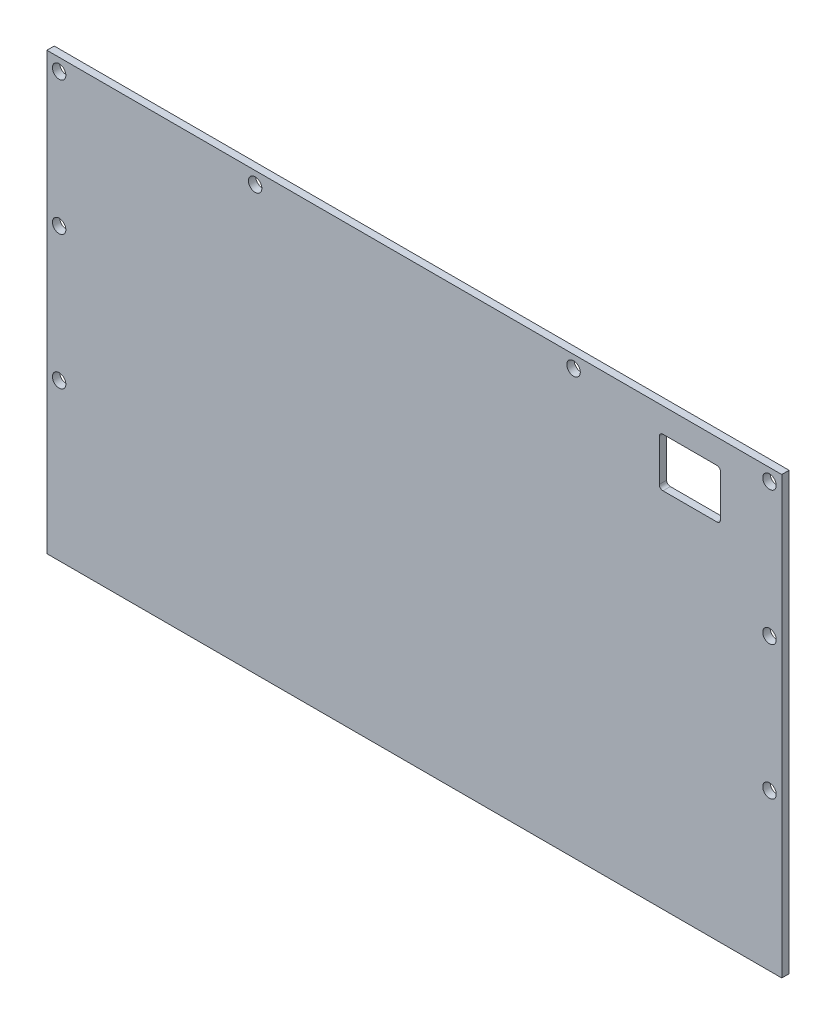
ISO-10303-21;
HEADER;
FILE_DESCRIPTION(('STEP AP214'),'2;1');
FILE_NAME('part.step','',(''),(''),'','','');
FILE_SCHEMA(('AUTOMOTIVE_DESIGN { 1 0 10303 214 1 1 1 1 }'));
ENDSEC;
DATA;
#1=APPLICATION_CONTEXT('core data for automotive mechanical design processes');
#2=APPLICATION_PROTOCOL_DEFINITION('international standard','automotive_design',2000,#1);
#3=PRODUCT_CONTEXT('',#1,'mechanical');
#4=PRODUCT('Part','Part','',(#3));
#5=PRODUCT_RELATED_PRODUCT_CATEGORY('part','',(#4));
#6=PRODUCT_DEFINITION_FORMATION('','',#4);
#7=PRODUCT_DEFINITION_CONTEXT('part definition',#1,'design');
#8=PRODUCT_DEFINITION('design','',#6,#7);
#9=PRODUCT_DEFINITION_SHAPE('','',#8);
#10=(LENGTH_UNIT() NAMED_UNIT(*) SI_UNIT(.MILLI.,.METRE.));
#11=(NAMED_UNIT(*) PLANE_ANGLE_UNIT() SI_UNIT($,.RADIAN.));
#12=(NAMED_UNIT(*) SI_UNIT($,.STERADIAN.) SOLID_ANGLE_UNIT());
#13=UNCERTAINTY_MEASURE_WITH_UNIT(LENGTH_MEASURE(1.E-05),#10,'distance_accuracy_value','');
#14=(GEOMETRIC_REPRESENTATION_CONTEXT(3) GLOBAL_UNCERTAINTY_ASSIGNED_CONTEXT((#13)) GLOBAL_UNIT_ASSIGNED_CONTEXT((#10,
#11,#12)) REPRESENTATION_CONTEXT('',''));
#15=CARTESIAN_POINT('',(0.,0.,0.));
#16=DIRECTION('',(0.,0.,1.));
#17=DIRECTION('',(1.,0.,0.));
#18=AXIS2_PLACEMENT_3D('',#15,#16,#17);
#19=CARTESIAN_POINT('',(0.,0.,3.));
#20=DIRECTION('',(0.,0.,-1.));
#21=DIRECTION('',(-1.,0.,0.));
#22=AXIS2_PLACEMENT_3D('',#19,#20,#21);
#23=PLANE('',#22);
#24=DIRECTION('',(1.,0.,0.));
#25=VECTOR('',#24,1.);
#26=CARTESIAN_POINT('',(250.,148.,3.));
#27=LINE('',#26,#25);
#28=CARTESIAN_POINT('',(251.5,148.,3.));
#29=VERTEX_POINT('',#28);
#30=CARTESIAN_POINT('',(273.5,148.,3.));
#31=VERTEX_POINT('',#30);
#32=EDGE_CURVE('E221',#29,#31,#27,.T.);
#33=ORIENTED_EDGE('',*,*,#32,.F.);
#34=CARTESIAN_POINT('',(251.5,149.5,3.));
#35=DIRECTION('',(0.,0.,-1.));
#36=DIRECTION('',(-1.,0.,0.));
#37=AXIS2_PLACEMENT_3D('',#34,#35,#36);
#38=CIRCLE('',#37,1.5);
#39=CARTESIAN_POINT('',(250.,149.5,3.));
#40=VERTEX_POINT('',#39);
#41=EDGE_CURVE('E47',#29,#40,#38,.T.);
#42=ORIENTED_EDGE('',*,*,#41,.T.);
#43=DIRECTION('',(0.,-1.,0.));
#44=VECTOR('',#43,1.);
#45=CARTESIAN_POINT('',(250.,168.,3.));
#46=LINE('',#45,#44);
#47=CARTESIAN_POINT('',(250.,166.5,3.));
#48=VERTEX_POINT('',#47);
#49=EDGE_CURVE('E220',#48,#40,#46,.T.);
#50=ORIENTED_EDGE('',*,*,#49,.F.);
#51=CARTESIAN_POINT('',(251.5,166.5,3.));
#52=DIRECTION('',(0.,0.,-1.));
#53=DIRECTION('',(-1.,0.,0.));
#54=AXIS2_PLACEMENT_3D('',#51,#52,#53);
#55=CIRCLE('',#54,1.5);
#56=CARTESIAN_POINT('',(251.5,168.,3.));
#57=VERTEX_POINT('',#56);
#58=EDGE_CURVE('E207',#48,#57,#55,.T.);
#59=ORIENTED_EDGE('',*,*,#58,.T.);
#60=DIRECTION('',(-1.,0.,0.));
#61=VECTOR('',#60,1.);
#62=CARTESIAN_POINT('',(250.,168.,3.));
#63=LINE('',#62,#61);
#64=CARTESIAN_POINT('',(273.5,168.,3.));
#65=VERTEX_POINT('',#64);
#66=EDGE_CURVE('E256',#65,#57,#63,.T.);
#67=ORIENTED_EDGE('',*,*,#66,.F.);
#68=CARTESIAN_POINT('',(273.5,166.5,3.));
#69=DIRECTION('',(0.,0.,-1.));
#70=DIRECTION('',(-1.,0.,0.));
#71=AXIS2_PLACEMENT_3D('',#68,#69,#70);
#72=CIRCLE('',#71,1.5);
#73=CARTESIAN_POINT('',(275.,166.5,3.));
#74=VERTEX_POINT('',#73);
#75=EDGE_CURVE('E211',#65,#74,#72,.T.);
#76=ORIENTED_EDGE('',*,*,#75,.T.);
#77=DIRECTION('',(0.,1.,0.));
#78=VECTOR('',#77,1.);
#79=CARTESIAN_POINT('',(275.,168.,3.));
#80=LINE('',#79,#78);
#81=CARTESIAN_POINT('',(275.,149.5,3.));
#82=VERTEX_POINT('',#81);
#83=EDGE_CURVE('E245',#82,#74,#80,.T.);
#84=ORIENTED_EDGE('',*,*,#83,.F.);
#85=CARTESIAN_POINT('',(273.5,149.5,3.));
#86=DIRECTION('',(0.,0.,-1.));
#87=DIRECTION('',(-1.,0.,0.));
#88=AXIS2_PLACEMENT_3D('',#85,#86,#87);
#89=CIRCLE('',#88,1.5);
#90=EDGE_CURVE('E54',#82,#31,#89,.T.);
#91=ORIENTED_EDGE('',*,*,#90,.T.);
#92=EDGE_LOOP('',(#33,#42,#50,#59,#67,#76,#84,#91));
#93=FACE_BOUND('',#92,.T.);
#94=CARTESIAN_POINT('',(215.,173.,3.));
#95=DIRECTION('',(0.,0.,1.));
#96=DIRECTION('',(1.,0.,0.));
#97=AXIS2_PLACEMENT_3D('',#94,#95,#96);
#98=CIRCLE('',#97,2.75);
#99=CARTESIAN_POINT('',(217.75,173.,3.));
#100=VERTEX_POINT('',#99);
#101=EDGE_CURVE('E178',#100,#100,#98,.T.);
#102=ORIENTED_EDGE('',*,*,#101,.F.);
#103=EDGE_LOOP('',(#102));
#104=FACE_BOUND('',#103,.T.);
#105=CARTESIAN_POINT('',(85.,173.,3.));
#106=DIRECTION('',(0.,0.,1.));
#107=DIRECTION('',(1.,0.,0.));
#108=AXIS2_PLACEMENT_3D('',#105,#106,#107);
#109=CIRCLE('',#108,2.75);
#110=CARTESIAN_POINT('',(87.75,173.,3.));
#111=VERTEX_POINT('',#110);
#112=EDGE_CURVE('E177',#111,#111,#109,.T.);
#113=ORIENTED_EDGE('',*,*,#112,.F.);
#114=EDGE_LOOP('',(#113));
#115=FACE_BOUND('',#114,.T.);
#116=CARTESIAN_POINT('',(5.,173.,3.));
#117=DIRECTION('',(0.,0.,1.));
#118=DIRECTION('',(1.,0.,0.));
#119=AXIS2_PLACEMENT_3D('',#116,#117,#118);
#120=CIRCLE('',#119,2.75);
#121=CARTESIAN_POINT('',(7.75,173.,3.));
#122=VERTEX_POINT('',#121);
#123=EDGE_CURVE('E270',#122,#122,#120,.T.);
#124=ORIENTED_EDGE('',*,*,#123,.F.);
#125=EDGE_LOOP('',(#124));
#126=FACE_BOUND('',#125,.T.);
#127=CARTESIAN_POINT('',(295.,63.77,3.));
#128=DIRECTION('',(0.,0.,1.));
#129=DIRECTION('',(1.,0.,0.));
#130=AXIS2_PLACEMENT_3D('',#127,#128,#129);
#131=CIRCLE('',#130,2.74999999999997);
#132=CARTESIAN_POINT('',(297.75,63.77,3.));
#133=VERTEX_POINT('',#132);
#134=EDGE_CURVE('E170',#133,#133,#131,.T.);
#135=ORIENTED_EDGE('',*,*,#134,.F.);
#136=EDGE_LOOP('',(#135));
#137=FACE_BOUND('',#136,.T.);
#138=CARTESIAN_POINT('',(295.,173.,3.));
#139=DIRECTION('',(0.,0.,1.));
#140=DIRECTION('',(1.,0.,0.));
#141=AXIS2_PLACEMENT_3D('',#138,#139,#140);
#142=CIRCLE('',#141,2.74999999999997);
#143=CARTESIAN_POINT('',(297.75,173.,3.));
#144=VERTEX_POINT('',#143);
#145=EDGE_CURVE('E166',#144,#144,#142,.T.);
#146=ORIENTED_EDGE('',*,*,#145,.F.);
#147=EDGE_LOOP('',(#146));
#148=FACE_BOUND('',#147,.T.);
#149=CARTESIAN_POINT('',(5.00000000000001,118.385,3.));
#150=DIRECTION('',(0.,0.,1.));
#151=DIRECTION('',(1.,0.,0.));
#152=AXIS2_PLACEMENT_3D('',#149,#150,#151);
#153=CIRCLE('',#152,2.75);
#154=CARTESIAN_POINT('',(7.75000000000001,118.385,3.));
#155=VERTEX_POINT('',#154);
#156=EDGE_CURVE('E165',#155,#155,#153,.T.);
#157=ORIENTED_EDGE('',*,*,#156,.F.);
#158=EDGE_LOOP('',(#157));
#159=FACE_BOUND('',#158,.T.);
#160=CARTESIAN_POINT('',(295.,118.385,3.));
#161=DIRECTION('',(0.,0.,1.));
#162=DIRECTION('',(1.,0.,0.));
#163=AXIS2_PLACEMENT_3D('',#160,#161,#162);
#164=CIRCLE('',#163,2.74999999999997);
#165=CARTESIAN_POINT('',(297.75,118.385,3.));
#166=VERTEX_POINT('',#165);
#167=EDGE_CURVE('E287',#166,#166,#164,.T.);
#168=ORIENTED_EDGE('',*,*,#167,.F.);
#169=EDGE_LOOP('',(#168));
#170=FACE_BOUND('',#169,.T.);
#171=DIRECTION('',(0.,-1.,0.));
#172=VECTOR('',#171,1.);
#173=CARTESIAN_POINT('',(0.,0.,3.));
#174=LINE('',#173,#172);
#175=CARTESIAN_POINT('',(0.,178.,3.));
#176=VERTEX_POINT('',#175);
#177=CARTESIAN_POINT('',(0.,0.,3.));
#178=VERTEX_POINT('',#177);
#179=EDGE_CURVE('E139',#176,#178,#174,.T.);
#180=ORIENTED_EDGE('',*,*,#179,.T.);
#181=DIRECTION('',(1.,0.,0.));
#182=VECTOR('',#181,1.);
#183=CARTESIAN_POINT('',(0.,0.,3.));
#184=LINE('',#183,#182);
#185=CARTESIAN_POINT('',(300.,0.,3.));
#186=VERTEX_POINT('',#185);
#187=EDGE_CURVE('E128',#178,#186,#184,.T.);
#188=ORIENTED_EDGE('',*,*,#187,.T.);
#189=DIRECTION('',(0.,1.,0.));
#190=VECTOR('',#189,1.);
#191=CARTESIAN_POINT('',(300.,0.,3.));
#192=LINE('',#191,#190);
#193=CARTESIAN_POINT('',(300.,178.,3.));
#194=VERTEX_POINT('',#193);
#195=EDGE_CURVE('E138',#186,#194,#192,.T.);
#196=ORIENTED_EDGE('',*,*,#195,.T.);
#197=DIRECTION('',(-1.,0.,0.));
#198=VECTOR('',#197,1.);
#199=CARTESIAN_POINT('',(0.,178.,3.));
#200=LINE('',#199,#198);
#201=EDGE_CURVE('E144',#194,#176,#200,.T.);
#202=ORIENTED_EDGE('',*,*,#201,.T.);
#203=EDGE_LOOP('',(#180,#188,#196,#202));
#204=FACE_BOUND('',#203,.T.);
#205=CARTESIAN_POINT('',(5.00000000000001,63.77,3.));
#206=DIRECTION('',(0.,0.,1.));
#207=DIRECTION('',(1.,0.,0.));
#208=AXIS2_PLACEMENT_3D('',#205,#206,#207);
#209=CIRCLE('',#208,2.75);
#210=CARTESIAN_POINT('',(7.75000000000001,63.77,3.));
#211=VERTEX_POINT('',#210);
#212=EDGE_CURVE('E174',#211,#211,#209,.T.);
#213=ORIENTED_EDGE('',*,*,#212,.F.);
#214=EDGE_LOOP('',(#213));
#215=FACE_BOUND('',#214,.T.);
#216=ADVANCED_FACE('F39',(#93,#104,#115,#126,#137,#148,#159,#170,#204,#215),#23,.F.);
#217=CARTESIAN_POINT('',(0.,0.,3.));
#218=DIRECTION('',(1.,0.,0.));
#219=DIRECTION('',(0.,0.,-1.));
#220=AXIS2_PLACEMENT_3D('',#217,#218,#219);
#221=PLANE('',#220);
#222=DIRECTION('',(0.,-1.,0.));
#223=VECTOR('',#222,1.);
#224=CARTESIAN_POINT('',(0.,0.,0.));
#225=LINE('',#224,#223);
#226=CARTESIAN_POINT('',(0.,178.,0.));
#227=VERTEX_POINT('',#226);
#228=CARTESIAN_POINT('',(0.,0.,0.));
#229=VERTEX_POINT('',#228);
#230=EDGE_CURVE('E152',#227,#229,#225,.T.);
#231=ORIENTED_EDGE('',*,*,#230,.T.);
#232=DIRECTION('',(0.,0.,-1.));
#233=VECTOR('',#232,1.);
#234=CARTESIAN_POINT('',(0.,0.,3.));
#235=LINE('',#234,#233);
#236=EDGE_CURVE('E132',#178,#229,#235,.T.);
#237=ORIENTED_EDGE('',*,*,#236,.F.);
#238=ORIENTED_EDGE('',*,*,#179,.F.);
#239=DIRECTION('',(0.,0.,-1.));
#240=VECTOR('',#239,1.);
#241=CARTESIAN_POINT('',(0.,178.,3.));
#242=LINE('',#241,#240);
#243=EDGE_CURVE('E295',#176,#227,#242,.T.);
#244=ORIENTED_EDGE('',*,*,#243,.T.);
#245=EDGE_LOOP('',(#231,#237,#238,#244));
#246=FACE_BOUND('',#245,.T.);
#247=ADVANCED_FACE('F150',(#246),#221,.F.);
#248=CARTESIAN_POINT('',(0.,0.,3.));
#249=DIRECTION('',(0.,1.,0.));
#250=DIRECTION('',(0.,0.,1.));
#251=AXIS2_PLACEMENT_3D('',#248,#249,#250);
#252=PLANE('',#251);
#253=DIRECTION('',(1.,0.,0.));
#254=VECTOR('',#253,1.);
#255=CARTESIAN_POINT('',(0.,0.,0.));
#256=LINE('',#255,#254);
#257=CARTESIAN_POINT('',(300.,0.,0.));
#258=VERTEX_POINT('',#257);
#259=EDGE_CURVE('E297',#229,#258,#256,.T.);
#260=ORIENTED_EDGE('',*,*,#259,.T.);
#261=DIRECTION('',(0.,0.,-1.));
#262=VECTOR('',#261,1.);
#263=CARTESIAN_POINT('',(300.,0.,3.));
#264=LINE('',#263,#262);
#265=EDGE_CURVE('E135',#186,#258,#264,.T.);
#266=ORIENTED_EDGE('',*,*,#265,.F.);
#267=ORIENTED_EDGE('',*,*,#187,.F.);
#268=ORIENTED_EDGE('',*,*,#236,.T.);
#269=EDGE_LOOP('',(#260,#266,#267,#268));
#270=FACE_BOUND('',#269,.T.);
#271=ADVANCED_FACE('F130',(#270),#252,.F.);
#272=CARTESIAN_POINT('',(300.,0.,3.));
#273=DIRECTION('',(-1.,0.,0.));
#274=DIRECTION('',(0.,0.,1.));
#275=AXIS2_PLACEMENT_3D('',#272,#273,#274);
#276=PLANE('',#275);
#277=DIRECTION('',(0.,1.,0.));
#278=VECTOR('',#277,1.);
#279=CARTESIAN_POINT('',(300.,0.,0.));
#280=LINE('',#279,#278);
#281=CARTESIAN_POINT('',(300.,178.,0.));
#282=VERTEX_POINT('',#281);
#283=EDGE_CURVE('E299',#258,#282,#280,.T.);
#284=ORIENTED_EDGE('',*,*,#283,.T.);
#285=DIRECTION('',(0.,0.,-1.));
#286=VECTOR('',#285,1.);
#287=CARTESIAN_POINT('',(300.,178.,3.));
#288=LINE('',#287,#286);
#289=EDGE_CURVE('E158',#194,#282,#288,.T.);
#290=ORIENTED_EDGE('',*,*,#289,.F.);
#291=ORIENTED_EDGE('',*,*,#195,.F.);
#292=ORIENTED_EDGE('',*,*,#265,.T.);
#293=EDGE_LOOP('',(#284,#290,#291,#292));
#294=FACE_BOUND('',#293,.T.);
#295=ADVANCED_FACE('F310',(#294),#276,.F.);
#296=CARTESIAN_POINT('',(0.,178.,3.));
#297=DIRECTION('',(0.,-1.,0.));
#298=DIRECTION('',(0.,0.,-1.));
#299=AXIS2_PLACEMENT_3D('',#296,#297,#298);
#300=PLANE('',#299);
#301=DIRECTION('',(-1.,0.,0.));
#302=VECTOR('',#301,1.);
#303=CARTESIAN_POINT('',(0.,178.,0.));
#304=LINE('',#303,#302);
#305=EDGE_CURVE('E148',#282,#227,#304,.T.);
#306=ORIENTED_EDGE('',*,*,#305,.T.);
#307=ORIENTED_EDGE('',*,*,#243,.F.);
#308=ORIENTED_EDGE('',*,*,#201,.F.);
#309=ORIENTED_EDGE('',*,*,#289,.T.);
#310=EDGE_LOOP('',(#306,#307,#308,#309));
#311=FACE_BOUND('',#310,.T.);
#312=ADVANCED_FACE('F306',(#311),#300,.F.);
#313=CARTESIAN_POINT('',(0.,0.,0.));
#314=DIRECTION('',(0.,0.,-1.));
#315=DIRECTION('',(-1.,0.,0.));
#316=AXIS2_PLACEMENT_3D('',#313,#314,#315);
#317=PLANE('',#316);
#318=DIRECTION('',(0.,1.,0.));
#319=VECTOR('',#318,1.);
#320=CARTESIAN_POINT('',(250.,-3.46944695195361E-13,0.));
#321=LINE('',#320,#319);
#322=CARTESIAN_POINT('',(250.,149.5,0.));
#323=VERTEX_POINT('',#322);
#324=CARTESIAN_POINT('',(250.,166.5,0.));
#325=VERTEX_POINT('',#324);
#326=EDGE_CURVE('E185',#323,#325,#321,.T.);
#327=ORIENTED_EDGE('',*,*,#326,.F.);
#328=CARTESIAN_POINT('',(251.5,149.5,0.));
#329=DIRECTION('',(0.,0.,-1.));
#330=DIRECTION('',(-1.,0.,0.));
#331=AXIS2_PLACEMENT_3D('',#328,#329,#330);
#332=CIRCLE('',#331,1.5);
#333=CARTESIAN_POINT('',(251.5,148.,0.));
#334=VERTEX_POINT('',#333);
#335=EDGE_CURVE('E11',#323,#334,#332,.F.);
#336=ORIENTED_EDGE('',*,*,#335,.T.);
#337=DIRECTION('',(-1.,0.,0.));
#338=VECTOR('',#337,1.);
#339=CARTESIAN_POINT('',(0.,148.,0.));
#340=LINE('',#339,#338);
#341=CARTESIAN_POINT('',(273.5,148.,0.));
#342=VERTEX_POINT('',#341);
#343=EDGE_CURVE('E153',#342,#334,#340,.T.);
#344=ORIENTED_EDGE('',*,*,#343,.F.);
#345=CARTESIAN_POINT('',(273.5,149.5,0.));
#346=DIRECTION('',(0.,0.,-1.));
#347=DIRECTION('',(-1.,0.,0.));
#348=AXIS2_PLACEMENT_3D('',#345,#346,#347);
#349=CIRCLE('',#348,1.5);
#350=CARTESIAN_POINT('',(275.,149.5,0.));
#351=VERTEX_POINT('',#350);
#352=EDGE_CURVE('E216',#342,#351,#349,.F.);
#353=ORIENTED_EDGE('',*,*,#352,.T.);
#354=DIRECTION('',(0.,-1.,0.));
#355=VECTOR('',#354,1.);
#356=CARTESIAN_POINT('',(275.,0.,0.));
#357=LINE('',#356,#355);
#358=CARTESIAN_POINT('',(275.,166.5,0.));
#359=VERTEX_POINT('',#358);
#360=EDGE_CURVE('E156',#359,#351,#357,.T.);
#361=ORIENTED_EDGE('',*,*,#360,.F.);
#362=CARTESIAN_POINT('',(273.5,166.5,0.));
#363=DIRECTION('',(0.,0.,-1.));
#364=DIRECTION('',(-1.,0.,0.));
#365=AXIS2_PLACEMENT_3D('',#362,#363,#364);
#366=CIRCLE('',#365,1.5);
#367=CARTESIAN_POINT('',(273.5,168.,0.));
#368=VERTEX_POINT('',#367);
#369=EDGE_CURVE('E213',#359,#368,#366,.F.);
#370=ORIENTED_EDGE('',*,*,#369,.T.);
#371=DIRECTION('',(1.,0.,0.));
#372=VECTOR('',#371,1.);
#373=CARTESIAN_POINT('',(0.,168.,0.));
#374=LINE('',#373,#372);
#375=CARTESIAN_POINT('',(251.5,168.,0.));
#376=VERTEX_POINT('',#375);
#377=EDGE_CURVE('E182',#376,#368,#374,.T.);
#378=ORIENTED_EDGE('',*,*,#377,.F.);
#379=CARTESIAN_POINT('',(251.5,166.5,0.));
#380=DIRECTION('',(0.,0.,-1.));
#381=DIRECTION('',(-1.,0.,0.));
#382=AXIS2_PLACEMENT_3D('',#379,#380,#381);
#383=CIRCLE('',#382,1.5);
#384=EDGE_CURVE('E209',#376,#325,#383,.F.);
#385=ORIENTED_EDGE('',*,*,#384,.T.);
#386=EDGE_LOOP('',(#327,#336,#344,#353,#361,#370,#378,#385));
#387=FACE_BOUND('',#386,.T.);
#388=CARTESIAN_POINT('',(215.,173.,0.));
#389=DIRECTION('',(0.,0.,-1.));
#390=DIRECTION('',(-1.,0.,0.));
#391=AXIS2_PLACEMENT_3D('',#388,#389,#390);
#392=CIRCLE('',#391,2.75);
#393=CARTESIAN_POINT('',(212.25,173.,0.));
#394=VERTEX_POINT('',#393);
#395=EDGE_CURVE('E175',#394,#394,#392,.T.);
#396=ORIENTED_EDGE('',*,*,#395,.F.);
#397=EDGE_LOOP('',(#396));
#398=FACE_BOUND('',#397,.T.);
#399=CARTESIAN_POINT('',(85.,173.,0.));
#400=DIRECTION('',(0.,0.,-1.));
#401=DIRECTION('',(-1.,0.,0.));
#402=AXIS2_PLACEMENT_3D('',#399,#400,#401);
#403=CIRCLE('',#402,2.75);
#404=CARTESIAN_POINT('',(82.25,173.,0.));
#405=VERTEX_POINT('',#404);
#406=EDGE_CURVE('E267',#405,#405,#403,.T.);
#407=ORIENTED_EDGE('',*,*,#406,.F.);
#408=EDGE_LOOP('',(#407));
#409=FACE_BOUND('',#408,.T.);
#410=CARTESIAN_POINT('',(5.,173.,0.));
#411=DIRECTION('',(0.,0.,-1.));
#412=DIRECTION('',(-1.,0.,0.));
#413=AXIS2_PLACEMENT_3D('',#410,#411,#412);
#414=CIRCLE('',#413,2.75);
#415=CARTESIAN_POINT('',(2.25,173.,0.));
#416=VERTEX_POINT('',#415);
#417=EDGE_CURVE('E273',#416,#416,#414,.T.);
#418=ORIENTED_EDGE('',*,*,#417,.F.);
#419=EDGE_LOOP('',(#418));
#420=FACE_BOUND('',#419,.T.);
#421=CARTESIAN_POINT('',(5.00000000000001,63.77,0.));
#422=DIRECTION('',(0.,0.,-1.));
#423=DIRECTION('',(-1.,0.,0.));
#424=AXIS2_PLACEMENT_3D('',#421,#422,#423);
#425=CIRCLE('',#424,2.75);
#426=CARTESIAN_POINT('',(2.25000000000001,63.77,0.));
#427=VERTEX_POINT('',#426);
#428=EDGE_CURVE('E171',#427,#427,#425,.T.);
#429=ORIENTED_EDGE('',*,*,#428,.F.);
#430=EDGE_LOOP('',(#429));
#431=FACE_BOUND('',#430,.T.);
#432=CARTESIAN_POINT('',(295.,63.77,0.));
#433=DIRECTION('',(0.,0.,-1.));
#434=DIRECTION('',(-1.,0.,0.));
#435=AXIS2_PLACEMENT_3D('',#432,#433,#434);
#436=CIRCLE('',#435,2.74999999999997);
#437=CARTESIAN_POINT('',(292.25,63.77,0.));
#438=VERTEX_POINT('',#437);
#439=EDGE_CURVE('E167',#438,#438,#436,.T.);
#440=ORIENTED_EDGE('',*,*,#439,.F.);
#441=EDGE_LOOP('',(#440));
#442=FACE_BOUND('',#441,.T.);
#443=CARTESIAN_POINT('',(295.,173.,0.));
#444=DIRECTION('',(0.,0.,-1.));
#445=DIRECTION('',(-1.,0.,0.));
#446=AXIS2_PLACEMENT_3D('',#443,#444,#445);
#447=CIRCLE('',#446,2.74999999999997);
#448=CARTESIAN_POINT('',(292.25,173.,0.));
#449=VERTEX_POINT('',#448);
#450=EDGE_CURVE('E162',#449,#449,#447,.T.);
#451=ORIENTED_EDGE('',*,*,#450,.F.);
#452=EDGE_LOOP('',(#451));
#453=FACE_BOUND('',#452,.T.);
#454=CARTESIAN_POINT('',(5.00000000000001,118.385,0.));
#455=DIRECTION('',(0.,0.,-1.));
#456=DIRECTION('',(-1.,0.,0.));
#457=AXIS2_PLACEMENT_3D('',#454,#455,#456);
#458=CIRCLE('',#457,2.75);
#459=CARTESIAN_POINT('',(2.25000000000001,118.385,0.));
#460=VERTEX_POINT('',#459);
#461=EDGE_CURVE('E284',#460,#460,#458,.T.);
#462=ORIENTED_EDGE('',*,*,#461,.F.);
#463=EDGE_LOOP('',(#462));
#464=FACE_BOUND('',#463,.T.);
#465=CARTESIAN_POINT('',(295.,118.385,0.));
#466=DIRECTION('',(0.,0.,-1.));
#467=DIRECTION('',(-1.,0.,0.));
#468=AXIS2_PLACEMENT_3D('',#465,#466,#467);
#469=CIRCLE('',#468,2.74999999999997);
#470=CARTESIAN_POINT('',(292.25,118.385,0.));
#471=VERTEX_POINT('',#470);
#472=EDGE_CURVE('E290',#471,#471,#469,.T.);
#473=ORIENTED_EDGE('',*,*,#472,.F.);
#474=EDGE_LOOP('',(#473));
#475=FACE_BOUND('',#474,.T.);
#476=ORIENTED_EDGE('',*,*,#230,.F.);
#477=ORIENTED_EDGE('',*,*,#305,.F.);
#478=ORIENTED_EDGE('',*,*,#283,.F.);
#479=ORIENTED_EDGE('',*,*,#259,.F.);
#480=EDGE_LOOP('',(#476,#477,#478,#479));
#481=FACE_BOUND('',#480,.T.);
#482=ADVANCED_FACE('F230',(#387,#398,#409,#420,#431,#442,#453,#464,#475,#481),#317,.T.);
#483=CARTESIAN_POINT('',(295.,118.385,3.));
#484=DIRECTION('',(0.,0.,1.));
#485=DIRECTION('',(1.,0.,0.));
#486=AXIS2_PLACEMENT_3D('',#483,#484,#485);
#487=CYLINDRICAL_SURFACE('',#486,2.74999999999997);
#488=ORIENTED_EDGE('',*,*,#472,.T.);
#489=EDGE_LOOP('',(#488));
#490=FACE_BOUND('',#489,.T.);
#491=ORIENTED_EDGE('',*,*,#167,.T.);
#492=EDGE_LOOP('',(#491));
#493=FACE_BOUND('',#492,.T.);
#494=ADVANCED_FACE('F329',(#490,#493),#487,.F.);
#495=CARTESIAN_POINT('',(5.00000000000001,118.385,3.));
#496=DIRECTION('',(0.,0.,1.));
#497=DIRECTION('',(1.,0.,0.));
#498=AXIS2_PLACEMENT_3D('',#495,#496,#497);
#499=CYLINDRICAL_SURFACE('',#498,2.75);
#500=ORIENTED_EDGE('',*,*,#461,.T.);
#501=EDGE_LOOP('',(#500));
#502=FACE_BOUND('',#501,.T.);
#503=ORIENTED_EDGE('',*,*,#156,.T.);
#504=EDGE_LOOP('',(#503));
#505=FACE_BOUND('',#504,.T.);
#506=ADVANCED_FACE('F335',(#502,#505),#499,.F.);
#507=CARTESIAN_POINT('',(295.,173.,3.));
#508=DIRECTION('',(0.,0.,1.));
#509=DIRECTION('',(1.,0.,0.));
#510=AXIS2_PLACEMENT_3D('',#507,#508,#509);
#511=CYLINDRICAL_SURFACE('',#510,2.74999999999997);
#512=ORIENTED_EDGE('',*,*,#450,.T.);
#513=EDGE_LOOP('',(#512));
#514=FACE_BOUND('',#513,.T.);
#515=ORIENTED_EDGE('',*,*,#145,.T.);
#516=EDGE_LOOP('',(#515));
#517=FACE_BOUND('',#516,.T.);
#518=ADVANCED_FACE('F340',(#514,#517),#511,.F.);
#519=CARTESIAN_POINT('',(295.,63.77,3.));
#520=DIRECTION('',(0.,0.,1.));
#521=DIRECTION('',(1.,0.,0.));
#522=AXIS2_PLACEMENT_3D('',#519,#520,#521);
#523=CYLINDRICAL_SURFACE('',#522,2.74999999999997);
#524=ORIENTED_EDGE('',*,*,#439,.T.);
#525=EDGE_LOOP('',(#524));
#526=FACE_BOUND('',#525,.T.);
#527=ORIENTED_EDGE('',*,*,#134,.T.);
#528=EDGE_LOOP('',(#527));
#529=FACE_BOUND('',#528,.T.);
#530=ADVANCED_FACE('F350',(#526,#529),#523,.F.);
#531=CARTESIAN_POINT('',(5.00000000000001,63.77,3.));
#532=DIRECTION('',(0.,0.,1.));
#533=DIRECTION('',(1.,0.,0.));
#534=AXIS2_PLACEMENT_3D('',#531,#532,#533);
#535=CYLINDRICAL_SURFACE('',#534,2.75);
#536=ORIENTED_EDGE('',*,*,#428,.T.);
#537=EDGE_LOOP('',(#536));
#538=FACE_BOUND('',#537,.T.);
#539=ORIENTED_EDGE('',*,*,#212,.T.);
#540=EDGE_LOOP('',(#539));
#541=FACE_BOUND('',#540,.T.);
#542=ADVANCED_FACE('F357',(#538,#541),#535,.F.);
#543=CARTESIAN_POINT('',(5.,173.,3.));
#544=DIRECTION('',(0.,0.,1.));
#545=DIRECTION('',(1.,0.,0.));
#546=AXIS2_PLACEMENT_3D('',#543,#544,#545);
#547=CYLINDRICAL_SURFACE('',#546,2.75);
#548=ORIENTED_EDGE('',*,*,#417,.T.);
#549=EDGE_LOOP('',(#548));
#550=FACE_BOUND('',#549,.T.);
#551=ORIENTED_EDGE('',*,*,#123,.T.);
#552=EDGE_LOOP('',(#551));
#553=FACE_BOUND('',#552,.T.);
#554=ADVANCED_FACE('F361',(#550,#553),#547,.F.);
#555=CARTESIAN_POINT('',(85.,173.,3.));
#556=DIRECTION('',(0.,0.,1.));
#557=DIRECTION('',(1.,0.,0.));
#558=AXIS2_PLACEMENT_3D('',#555,#556,#557);
#559=CYLINDRICAL_SURFACE('',#558,2.75);
#560=ORIENTED_EDGE('',*,*,#406,.T.);
#561=EDGE_LOOP('',(#560));
#562=FACE_BOUND('',#561,.T.);
#563=ORIENTED_EDGE('',*,*,#112,.T.);
#564=EDGE_LOOP('',(#563));
#565=FACE_BOUND('',#564,.T.);
#566=ADVANCED_FACE('F365',(#562,#565),#559,.F.);
#567=CARTESIAN_POINT('',(215.,173.,3.));
#568=DIRECTION('',(0.,0.,1.));
#569=DIRECTION('',(1.,0.,0.));
#570=AXIS2_PLACEMENT_3D('',#567,#568,#569);
#571=CYLINDRICAL_SURFACE('',#570,2.75);
#572=ORIENTED_EDGE('',*,*,#395,.T.);
#573=EDGE_LOOP('',(#572));
#574=FACE_BOUND('',#573,.T.);
#575=ORIENTED_EDGE('',*,*,#101,.T.);
#576=EDGE_LOOP('',(#575));
#577=FACE_BOUND('',#576,.T.);
#578=ADVANCED_FACE('F369',(#574,#577),#571,.F.);
#579=CARTESIAN_POINT('',(250.,168.,-7.));
#580=DIRECTION('',(-1.,0.,0.));
#581=DIRECTION('',(0.,-1.,0.));
#582=AXIS2_PLACEMENT_3D('',#579,#580,#581);
#583=PLANE('',#582);
#584=ORIENTED_EDGE('',*,*,#326,.T.);
#585=DIRECTION('',(0.,0.,1.));
#586=VECTOR('',#585,1.);
#587=CARTESIAN_POINT('',(250.,166.5,3.));
#588=LINE('',#587,#586);
#589=EDGE_CURVE('E190',#325,#48,#588,.T.);
#590=ORIENTED_EDGE('',*,*,#589,.T.);
#591=ORIENTED_EDGE('',*,*,#49,.T.);
#592=DIRECTION('',(0.,0.,1.));
#593=VECTOR('',#592,1.);
#594=CARTESIAN_POINT('',(250.,149.5,0.));
#595=LINE('',#594,#593);
#596=EDGE_CURVE('E188',#40,#323,#595,.F.);
#597=ORIENTED_EDGE('',*,*,#596,.T.);
#598=EDGE_LOOP('',(#584,#590,#591,#597));
#599=FACE_BOUND('',#598,.T.);
#600=ADVANCED_FACE('F223',(#599),#583,.F.);
#601=CARTESIAN_POINT('',(250.,168.,-7.));
#602=DIRECTION('',(0.,1.,0.));
#603=DIRECTION('',(0.,0.,1.));
#604=AXIS2_PLACEMENT_3D('',#601,#602,#603);
#605=PLANE('',#604);
#606=ORIENTED_EDGE('',*,*,#66,.T.);
#607=DIRECTION('',(0.,0.,1.));
#608=VECTOR('',#607,1.);
#609=CARTESIAN_POINT('',(251.5,168.,0.));
#610=LINE('',#609,#608);
#611=EDGE_CURVE('E196',#57,#376,#610,.F.);
#612=ORIENTED_EDGE('',*,*,#611,.T.);
#613=ORIENTED_EDGE('',*,*,#377,.T.);
#614=DIRECTION('',(0.,0.,1.));
#615=VECTOR('',#614,1.);
#616=CARTESIAN_POINT('',(273.5,168.,3.));
#617=LINE('',#616,#615);
#618=EDGE_CURVE('E193',#368,#65,#617,.T.);
#619=ORIENTED_EDGE('',*,*,#618,.T.);
#620=EDGE_LOOP('',(#606,#612,#613,#619));
#621=FACE_BOUND('',#620,.T.);
#622=ADVANCED_FACE('F253',(#621),#605,.F.);
#623=CARTESIAN_POINT('',(275.,168.,-7.));
#624=DIRECTION('',(1.,0.,0.));
#625=DIRECTION('',(0.,0.,-1.));
#626=AXIS2_PLACEMENT_3D('',#623,#624,#625);
#627=PLANE('',#626);
#628=ORIENTED_EDGE('',*,*,#83,.T.);
#629=DIRECTION('',(0.,0.,1.));
#630=VECTOR('',#629,1.);
#631=CARTESIAN_POINT('',(275.,166.5,0.));
#632=LINE('',#631,#630);
#633=EDGE_CURVE('E201',#74,#359,#632,.F.);
#634=ORIENTED_EDGE('',*,*,#633,.T.);
#635=ORIENTED_EDGE('',*,*,#360,.T.);
#636=DIRECTION('',(0.,0.,1.));
#637=VECTOR('',#636,1.);
#638=CARTESIAN_POINT('',(275.,149.5,3.));
#639=LINE('',#638,#637);
#640=EDGE_CURVE('E198',#351,#82,#639,.T.);
#641=ORIENTED_EDGE('',*,*,#640,.T.);
#642=EDGE_LOOP('',(#628,#634,#635,#641));
#643=FACE_BOUND('',#642,.T.);
#644=ADVANCED_FACE('F243',(#643),#627,.F.);
#645=CARTESIAN_POINT('',(250.,148.,-7.));
#646=DIRECTION('',(0.,-1.,0.));
#647=DIRECTION('',(0.,0.,-1.));
#648=AXIS2_PLACEMENT_3D('',#645,#646,#647);
#649=PLANE('',#648);
#650=ORIENTED_EDGE('',*,*,#32,.T.);
#651=DIRECTION('',(0.,0.,1.));
#652=VECTOR('',#651,1.);
#653=CARTESIAN_POINT('',(273.5,148.,0.));
#654=LINE('',#653,#652);
#655=EDGE_CURVE('E205',#31,#342,#654,.F.);
#656=ORIENTED_EDGE('',*,*,#655,.T.);
#657=ORIENTED_EDGE('',*,*,#343,.T.);
#658=DIRECTION('',(0.,0.,1.));
#659=VECTOR('',#658,1.);
#660=CARTESIAN_POINT('',(251.5,148.,3.));
#661=LINE('',#660,#659);
#662=EDGE_CURVE('E203',#334,#29,#661,.T.);
#663=ORIENTED_EDGE('',*,*,#662,.T.);
#664=EDGE_LOOP('',(#650,#656,#657,#663));
#665=FACE_BOUND('',#664,.T.);
#666=ADVANCED_FACE('F234',(#665),#649,.F.);
#667=CARTESIAN_POINT('',(251.5,166.5,-7.));
#668=DIRECTION('',(0.,0.,-1.));
#669=DIRECTION('',(-1.,0.,0.));
#670=AXIS2_PLACEMENT_3D('',#667,#668,#669);
#671=CYLINDRICAL_SURFACE('',#670,1.5);
#672=ORIENTED_EDGE('',*,*,#384,.F.);
#673=ORIENTED_EDGE('',*,*,#611,.F.);
#674=ORIENTED_EDGE('',*,*,#58,.F.);
#675=ORIENTED_EDGE('',*,*,#589,.F.);
#676=EDGE_LOOP('',(#672,#673,#674,#675));
#677=FACE_BOUND('',#676,.T.);
#678=ADVANCED_FACE('F258',(#677),#671,.F.);
#679=CARTESIAN_POINT('',(273.5,166.5,-7.));
#680=DIRECTION('',(0.,0.,-1.));
#681=DIRECTION('',(-1.,0.,0.));
#682=AXIS2_PLACEMENT_3D('',#679,#680,#681);
#683=CYLINDRICAL_SURFACE('',#682,1.5);
#684=ORIENTED_EDGE('',*,*,#369,.F.);
#685=ORIENTED_EDGE('',*,*,#633,.F.);
#686=ORIENTED_EDGE('',*,*,#75,.F.);
#687=ORIENTED_EDGE('',*,*,#618,.F.);
#688=EDGE_LOOP('',(#684,#685,#686,#687));
#689=FACE_BOUND('',#688,.T.);
#690=ADVANCED_FACE('F247',(#689),#683,.F.);
#691=CARTESIAN_POINT('',(273.5,149.5,-7.));
#692=DIRECTION('',(0.,0.,-1.));
#693=DIRECTION('',(-1.,0.,0.));
#694=AXIS2_PLACEMENT_3D('',#691,#692,#693);
#695=CYLINDRICAL_SURFACE('',#694,1.5);
#696=ORIENTED_EDGE('',*,*,#352,.F.);
#697=ORIENTED_EDGE('',*,*,#655,.F.);
#698=ORIENTED_EDGE('',*,*,#90,.F.);
#699=ORIENTED_EDGE('',*,*,#640,.F.);
#700=EDGE_LOOP('',(#696,#697,#698,#699));
#701=FACE_BOUND('',#700,.T.);
#702=ADVANCED_FACE('F237',(#701),#695,.F.);
#703=CARTESIAN_POINT('',(251.5,149.5,-7.));
#704=DIRECTION('',(0.,0.,-1.));
#705=DIRECTION('',(-1.,0.,0.));
#706=AXIS2_PLACEMENT_3D('',#703,#704,#705);
#707=CYLINDRICAL_SURFACE('',#706,1.5);
#708=ORIENTED_EDGE('',*,*,#335,.F.);
#709=ORIENTED_EDGE('',*,*,#596,.F.);
#710=ORIENTED_EDGE('',*,*,#41,.F.);
#711=ORIENTED_EDGE('',*,*,#662,.F.);
#712=EDGE_LOOP('',(#708,#709,#710,#711));
#713=FACE_BOUND('',#712,.T.);
#714=ADVANCED_FACE('F41',(#713),#707,.F.);
#715=CLOSED_SHELL('',(#216,#247,#271,#295,#312,#482,#494,#506,#518,#530,#542,#554,#566,#578,
#600,#622,#644,#666,#678,#690,#702,#714));
#716=MANIFOLD_SOLID_BREP('B2',#715);
#717=ADVANCED_BREP_SHAPE_REPRESENTATION('',(#18,#716),#14);
#718=SHAPE_DEFINITION_REPRESENTATION(#9,#717);
ENDSEC;
END-ISO-10303-21;
